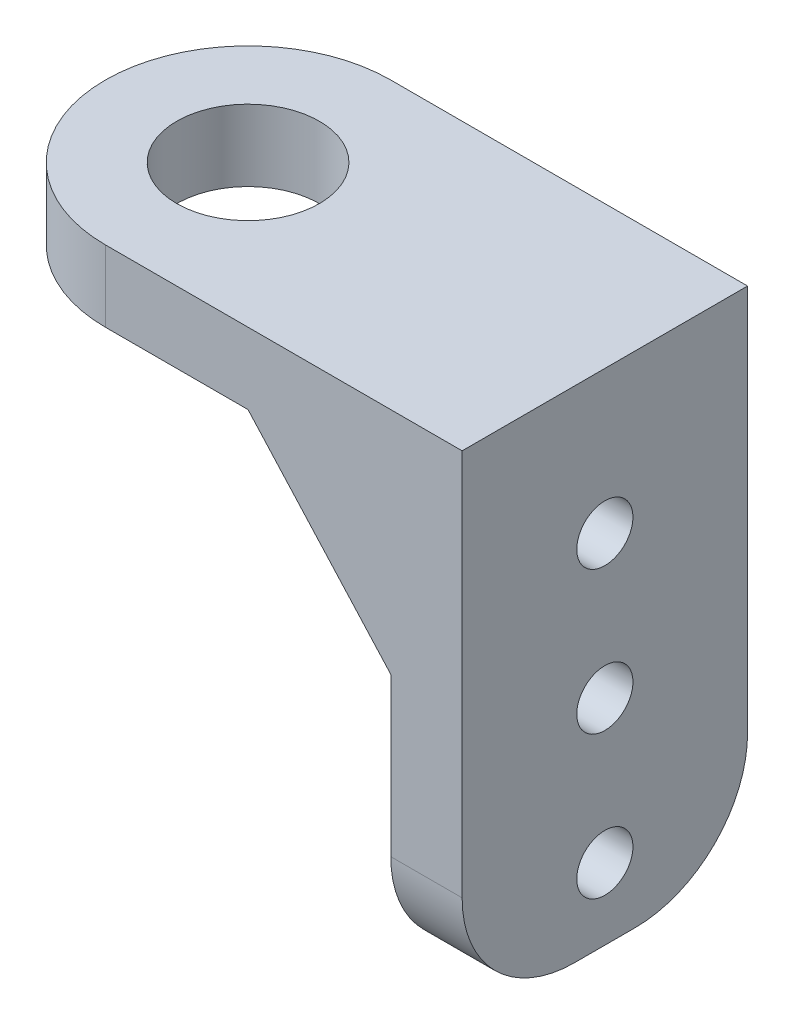
ISO-10303-21;
HEADER;
FILE_DESCRIPTION(('STEP AP214'),'2;1');
FILE_NAME('part.step','',(''),(''),'','','');
FILE_SCHEMA(('AUTOMOTIVE_DESIGN { 1 0 10303 214 1 1 1 1 }'));
ENDSEC;
DATA;
#1=APPLICATION_CONTEXT('core data for automotive mechanical design processes');
#2=APPLICATION_PROTOCOL_DEFINITION('international standard','automotive_design',2000,#1);
#3=PRODUCT_CONTEXT('',#1,'mechanical');
#4=PRODUCT('Part','Part','',(#3));
#5=PRODUCT_RELATED_PRODUCT_CATEGORY('part','',(#4));
#6=PRODUCT_DEFINITION_FORMATION('','',#4);
#7=PRODUCT_DEFINITION_CONTEXT('part definition',#1,'design');
#8=PRODUCT_DEFINITION('design','',#6,#7);
#9=PRODUCT_DEFINITION_SHAPE('','',#8);
#10=(LENGTH_UNIT() NAMED_UNIT(*) SI_UNIT(.MILLI.,.METRE.));
#11=(NAMED_UNIT(*) PLANE_ANGLE_UNIT() SI_UNIT($,.RADIAN.));
#12=(NAMED_UNIT(*) SI_UNIT($,.STERADIAN.) SOLID_ANGLE_UNIT());
#13=UNCERTAINTY_MEASURE_WITH_UNIT(LENGTH_MEASURE(1.E-05),#10,'distance_accuracy_value','');
#14=(GEOMETRIC_REPRESENTATION_CONTEXT(3) GLOBAL_UNCERTAINTY_ASSIGNED_CONTEXT((#13)) GLOBAL_UNIT_ASSIGNED_CONTEXT((#10,
#11,#12)) REPRESENTATION_CONTEXT('',''));
#15=CARTESIAN_POINT('',(0.,0.,0.));
#16=DIRECTION('',(0.,0.,1.));
#17=DIRECTION('',(1.,0.,0.));
#18=AXIS2_PLACEMENT_3D('',#15,#16,#17);
#19=CARTESIAN_POINT('',(0.,3.175,-12.7));
#20=DIRECTION('',(0.,0.,-1.));
#21=DIRECTION('',(-1.,0.,0.));
#22=AXIS2_PLACEMENT_3D('',#19,#20,#21);
#23=PLANE('',#22);
#24=DIRECTION('',(0.670567611253811,-0.741848420324097,0.));
#25=VECTOR('',#24,1.);
#26=CARTESIAN_POINT('',(12.7,-3.175,-12.7));
#27=LINE('',#26,#25);
#28=CARTESIAN_POINT('',(12.7,-3.175,-12.7));
#29=VERTEX_POINT('',#28);
#30=CARTESIAN_POINT('',(25.4,-17.225,-12.7));
#31=VERTEX_POINT('',#30);
#32=EDGE_CURVE('E133',#29,#31,#27,.T.);
#33=ORIENTED_EDGE('',*,*,#32,.F.);
#34=DIRECTION('',(1.,0.,0.));
#35=VECTOR('',#34,1.);
#36=CARTESIAN_POINT('',(0.,-3.175,-12.7));
#37=LINE('',#36,#35);
#38=CARTESIAN_POINT('',(0.,-3.175,-12.7));
#39=VERTEX_POINT('',#38);
#40=EDGE_CURVE('E146',#39,#29,#37,.T.);
#41=ORIENTED_EDGE('',*,*,#40,.F.);
#42=DIRECTION('',(0.,-1.,0.));
#43=VECTOR('',#42,1.);
#44=CARTESIAN_POINT('',(0.,3.175,-12.7));
#45=LINE('',#44,#43);
#46=CARTESIAN_POINT('',(0.,3.175,-12.7));
#47=VERTEX_POINT('',#46);
#48=EDGE_CURVE('E245',#47,#39,#45,.T.);
#49=ORIENTED_EDGE('',*,*,#48,.F.);
#50=DIRECTION('',(1.,0.,0.));
#51=VECTOR('',#50,1.);
#52=CARTESIAN_POINT('',(0.,3.175,-12.7));
#53=LINE('',#52,#51);
#54=CARTESIAN_POINT('',(31.75,3.175,-12.7));
#55=VERTEX_POINT('',#54);
#56=EDGE_CURVE('E205',#47,#55,#53,.T.);
#57=ORIENTED_EDGE('',*,*,#56,.T.);
#58=DIRECTION('',(0.,-1.,0.));
#59=VECTOR('',#58,1.);
#60=CARTESIAN_POINT('',(31.75,3.175,-12.7));
#61=LINE('',#60,#59);
#62=CARTESIAN_POINT('',(31.75,-31.275,-12.7));
#63=VERTEX_POINT('',#62);
#64=EDGE_CURVE('E223',#55,#63,#61,.T.);
#65=ORIENTED_EDGE('',*,*,#64,.T.);
#66=DIRECTION('',(1.,0.,0.));
#67=VECTOR('',#66,1.);
#68=CARTESIAN_POINT('',(0.,-31.2749999999999,-12.7));
#69=LINE('',#68,#67);
#70=CARTESIAN_POINT('',(25.4,-31.275,-12.7));
#71=VERTEX_POINT('',#70);
#72=EDGE_CURVE('E273',#63,#71,#69,.F.);
#73=ORIENTED_EDGE('',*,*,#72,.T.);
#74=DIRECTION('',(0.,-1.,0.));
#75=VECTOR('',#74,1.);
#76=CARTESIAN_POINT('',(25.4,-3.175,-12.7));
#77=LINE('',#76,#75);
#78=EDGE_CURVE('E192',#31,#71,#77,.T.);
#79=ORIENTED_EDGE('',*,*,#78,.F.);
#80=EDGE_LOOP('',(#33,#41,#49,#57,#65,#73,#79));
#81=FACE_BOUND('',#80,.T.);
#82=ADVANCED_FACE('F39',(#81),#23,.T.);
#83=CARTESIAN_POINT('',(0.,3.175,0.));
#84=DIRECTION('',(0.,-1.,0.));
#85=DIRECTION('',(0.,0.,-1.));
#86=AXIS2_PLACEMENT_3D('',#83,#84,#85);
#87=CYLINDRICAL_SURFACE('',#86,12.7);
#88=CARTESIAN_POINT('',(0.,-3.175,0.));
#89=DIRECTION('',(0.,1.,0.));
#90=DIRECTION('',(0.,0.,1.));
#91=AXIS2_PLACEMENT_3D('',#88,#89,#90);
#92=CIRCLE('',#91,12.7);
#93=CARTESIAN_POINT('',(0.,-3.175,12.7));
#94=VERTEX_POINT('',#93);
#95=EDGE_CURVE('E226',#39,#94,#92,.T.);
#96=ORIENTED_EDGE('',*,*,#95,.T.);
#97=DIRECTION('',(0.,-1.,0.));
#98=VECTOR('',#97,1.);
#99=CARTESIAN_POINT('',(0.,3.175,12.7));
#100=LINE('',#99,#98);
#101=CARTESIAN_POINT('',(0.,3.175,12.7));
#102=VERTEX_POINT('',#101);
#103=EDGE_CURVE('E241',#102,#94,#100,.T.);
#104=ORIENTED_EDGE('',*,*,#103,.F.);
#105=CARTESIAN_POINT('',(0.,3.175,0.));
#106=DIRECTION('',(0.,1.,0.));
#107=DIRECTION('',(0.,0.,1.));
#108=AXIS2_PLACEMENT_3D('',#105,#106,#107);
#109=CIRCLE('',#108,12.7);
#110=EDGE_CURVE('E208',#47,#102,#109,.T.);
#111=ORIENTED_EDGE('',*,*,#110,.F.);
#112=ORIENTED_EDGE('',*,*,#48,.T.);
#113=EDGE_LOOP('',(#96,#104,#111,#112));
#114=FACE_BOUND('',#113,.T.);
#115=ADVANCED_FACE('F303',(#114),#87,.T.);
#116=CARTESIAN_POINT('',(0.,3.175,12.7));
#117=DIRECTION('',(0.,0.,1.));
#118=DIRECTION('',(1.,0.,0.));
#119=AXIS2_PLACEMENT_3D('',#116,#117,#118);
#120=PLANE('',#119);
#121=DIRECTION('',(1.,0.,0.));
#122=VECTOR('',#121,1.);
#123=CARTESIAN_POINT('',(0.,-31.2749999999999,12.7));
#124=LINE('',#123,#122);
#125=CARTESIAN_POINT('',(25.4,-31.275,12.7));
#126=VERTEX_POINT('',#125);
#127=CARTESIAN_POINT('',(31.75,-31.275,12.7));
#128=VERTEX_POINT('',#127);
#129=EDGE_CURVE('E248',#126,#128,#124,.T.);
#130=ORIENTED_EDGE('',*,*,#129,.T.);
#131=DIRECTION('',(0.,-1.,0.));
#132=VECTOR('',#131,1.);
#133=CARTESIAN_POINT('',(31.75,3.175,12.7));
#134=LINE('',#133,#132);
#135=CARTESIAN_POINT('',(31.75,3.175,12.7));
#136=VERTEX_POINT('',#135);
#137=EDGE_CURVE('E238',#136,#128,#134,.T.);
#138=ORIENTED_EDGE('',*,*,#137,.F.);
#139=DIRECTION('',(-1.,0.,0.));
#140=VECTOR('',#139,1.);
#141=CARTESIAN_POINT('',(0.,3.175,12.7));
#142=LINE('',#141,#140);
#143=EDGE_CURVE('E213',#136,#102,#142,.T.);
#144=ORIENTED_EDGE('',*,*,#143,.T.);
#145=ORIENTED_EDGE('',*,*,#103,.T.);
#146=DIRECTION('',(-1.,0.,0.));
#147=VECTOR('',#146,1.);
#148=CARTESIAN_POINT('',(0.,-3.175,12.7));
#149=LINE('',#148,#147);
#150=CARTESIAN_POINT('',(12.7,-3.175,12.7));
#151=VERTEX_POINT('',#150);
#152=EDGE_CURVE('E230',#151,#94,#149,.T.);
#153=ORIENTED_EDGE('',*,*,#152,.F.);
#154=DIRECTION('',(0.670567611253811,-0.741848420324097,0.));
#155=VECTOR('',#154,1.);
#156=CARTESIAN_POINT('',(12.7,-3.175,12.7));
#157=LINE('',#156,#155);
#158=CARTESIAN_POINT('',(25.4,-17.225,12.7));
#159=VERTEX_POINT('',#158);
#160=EDGE_CURVE('E152',#151,#159,#157,.T.);
#161=ORIENTED_EDGE('',*,*,#160,.T.);
#162=DIRECTION('',(0.,-1.,0.));
#163=VECTOR('',#162,1.);
#164=CARTESIAN_POINT('',(25.4,-3.175,12.7));
#165=LINE('',#164,#163);
#166=EDGE_CURVE('E170',#159,#126,#165,.T.);
#167=ORIENTED_EDGE('',*,*,#166,.T.);
#168=EDGE_LOOP('',(#130,#138,#144,#145,#153,#161,#167));
#169=FACE_BOUND('',#168,.T.);
#170=ADVANCED_FACE('F297',(#169),#120,.T.);
#171=CARTESIAN_POINT('',(31.75,3.175,0.));
#172=DIRECTION('',(1.,0.,0.));
#173=DIRECTION('',(0.,0.,-1.));
#174=AXIS2_PLACEMENT_3D('',#171,#172,#173);
#175=PLANE('',#174);
#176=CARTESIAN_POINT('',(31.75,-31.275,-2.7));
#177=DIRECTION('',(1.,0.,0.));
#178=DIRECTION('',(0.,0.,-1.));
#179=AXIS2_PLACEMENT_3D('',#176,#177,#178);
#180=CIRCLE('',#179,10.);
#181=CARTESIAN_POINT('',(31.75,-41.275,-2.7));
#182=VERTEX_POINT('',#181);
#183=EDGE_CURVE('E252',#182,#63,#180,.T.);
#184=ORIENTED_EDGE('',*,*,#183,.T.);
#185=ORIENTED_EDGE('',*,*,#64,.F.);
#186=DIRECTION('',(0.,0.,1.));
#187=VECTOR('',#186,1.);
#188=CARTESIAN_POINT('',(31.75,3.175,0.));
#189=LINE('',#188,#187);
#190=EDGE_CURVE('E216',#55,#136,#189,.T.);
#191=ORIENTED_EDGE('',*,*,#190,.T.);
#192=ORIENTED_EDGE('',*,*,#137,.T.);
#193=CARTESIAN_POINT('',(31.75,-31.275,2.7));
#194=DIRECTION('',(1.,0.,0.));
#195=DIRECTION('',(0.,0.,-1.));
#196=AXIS2_PLACEMENT_3D('',#193,#194,#195);
#197=CIRCLE('',#196,10.);
#198=CARTESIAN_POINT('',(31.75,-41.275,2.7));
#199=VERTEX_POINT('',#198);
#200=EDGE_CURVE('E256',#128,#199,#197,.T.);
#201=ORIENTED_EDGE('',*,*,#200,.T.);
#202=DIRECTION('',(0.,0.,1.));
#203=VECTOR('',#202,1.);
#204=CARTESIAN_POINT('',(31.75,-41.275,-51.3255420673937));
#205=LINE('',#204,#203);
#206=EDGE_CURVE('E196',#182,#199,#205,.T.);
#207=ORIENTED_EDGE('',*,*,#206,.F.);
#208=EDGE_LOOP('',(#184,#185,#191,#192,#201,#207));
#209=FACE_BOUND('',#208,.T.);
#210=CARTESIAN_POINT('',(31.75,-34.925,0.));
#211=DIRECTION('',(-1.,0.,0.));
#212=DIRECTION('',(0.,-1.,0.));
#213=AXIS2_PLACEMENT_3D('',#210,#211,#212);
#214=CIRCLE('',#213,2.5);
#215=CARTESIAN_POINT('',(31.75,-37.425,0.));
#216=VERTEX_POINT('',#215);
#217=EDGE_CURVE('E166',#216,#216,#214,.T.);
#218=ORIENTED_EDGE('',*,*,#217,.T.);
#219=EDGE_LOOP('',(#218));
#220=FACE_BOUND('',#219,.T.);
#221=CARTESIAN_POINT('',(31.75,-9.52499999999998,0.));
#222=DIRECTION('',(-1.,0.,0.));
#223=DIRECTION('',(0.,-1.,0.));
#224=AXIS2_PLACEMENT_3D('',#221,#222,#223);
#225=CIRCLE('',#224,2.5);
#226=CARTESIAN_POINT('',(31.75,-12.025,0.));
#227=VERTEX_POINT('',#226);
#228=EDGE_CURVE('E175',#227,#227,#225,.T.);
#229=ORIENTED_EDGE('',*,*,#228,.T.);
#230=EDGE_LOOP('',(#229));
#231=FACE_BOUND('',#230,.T.);
#232=CARTESIAN_POINT('',(31.75,-22.225,0.));
#233=DIRECTION('',(-1.,0.,0.));
#234=DIRECTION('',(0.,-1.,0.));
#235=AXIS2_PLACEMENT_3D('',#232,#233,#234);
#236=CIRCLE('',#235,2.5);
#237=CARTESIAN_POINT('',(31.75,-24.725,0.));
#238=VERTEX_POINT('',#237);
#239=EDGE_CURVE('E183',#238,#238,#236,.T.);
#240=ORIENTED_EDGE('',*,*,#239,.T.);
#241=EDGE_LOOP('',(#240));
#242=FACE_BOUND('',#241,.T.);
#243=ADVANCED_FACE('F319',(#209,#220,#231,#242),#175,.T.);
#244=CARTESIAN_POINT('',(0.,3.175,0.));
#245=DIRECTION('',(0.,-1.,0.));
#246=DIRECTION('',(0.,0.,-1.));
#247=AXIS2_PLACEMENT_3D('',#244,#245,#246);
#248=CYLINDRICAL_SURFACE('',#247,6.35);
#249=CARTESIAN_POINT('',(0.,3.175,0.));
#250=DIRECTION('',(0.,1.,0.));
#251=DIRECTION('',(0.,0.,1.));
#252=AXIS2_PLACEMENT_3D('',#249,#250,#251);
#253=CIRCLE('',#252,6.35);
#254=CARTESIAN_POINT('',(0.,3.175,6.35));
#255=VERTEX_POINT('',#254);
#256=EDGE_CURVE('E219',#255,#255,#253,.T.);
#257=ORIENTED_EDGE('',*,*,#256,.T.);
#258=EDGE_LOOP('',(#257));
#259=FACE_BOUND('',#258,.T.);
#260=CARTESIAN_POINT('',(0.,-3.175,0.));
#261=DIRECTION('',(0.,1.,0.));
#262=DIRECTION('',(0.,0.,1.));
#263=AXIS2_PLACEMENT_3D('',#260,#261,#262);
#264=CIRCLE('',#263,6.35);
#265=CARTESIAN_POINT('',(0.,-3.175,6.35));
#266=VERTEX_POINT('',#265);
#267=EDGE_CURVE('E209',#266,#266,#264,.T.);
#268=ORIENTED_EDGE('',*,*,#267,.F.);
#269=EDGE_LOOP('',(#268));
#270=FACE_BOUND('',#269,.T.);
#271=ADVANCED_FACE('F331',(#259,#270),#248,.F.);
#272=CARTESIAN_POINT('',(0.,3.175,0.));
#273=DIRECTION('',(0.,1.,0.));
#274=DIRECTION('',(0.,0.,1.));
#275=AXIS2_PLACEMENT_3D('',#272,#273,#274);
#276=PLANE('',#275);
#277=ORIENTED_EDGE('',*,*,#190,.F.);
#278=ORIENTED_EDGE('',*,*,#56,.F.);
#279=ORIENTED_EDGE('',*,*,#110,.T.);
#280=ORIENTED_EDGE('',*,*,#143,.F.);
#281=EDGE_LOOP('',(#277,#278,#279,#280));
#282=FACE_BOUND('',#281,.T.);
#283=ORIENTED_EDGE('',*,*,#256,.F.);
#284=EDGE_LOOP('',(#283));
#285=FACE_BOUND('',#284,.T.);
#286=ADVANCED_FACE('F327',(#282,#285),#276,.T.);
#287=CARTESIAN_POINT('',(0.,-3.175,0.));
#288=DIRECTION('',(0.,1.,0.));
#289=DIRECTION('',(0.,0.,1.));
#290=AXIS2_PLACEMENT_3D('',#287,#288,#289);
#291=PLANE('',#290);
#292=ORIENTED_EDGE('',*,*,#40,.T.);
#293=DIRECTION('',(0.,0.,-1.));
#294=VECTOR('',#293,1.);
#295=CARTESIAN_POINT('',(12.7,-3.175,0.));
#296=LINE('',#295,#294);
#297=CARTESIAN_POINT('',(12.7,-3.175,-8.7));
#298=VERTEX_POINT('',#297);
#299=EDGE_CURVE('E132',#29,#298,#296,.F.);
#300=ORIENTED_EDGE('',*,*,#299,.T.);
#301=DIRECTION('',(-1.,0.,0.));
#302=VECTOR('',#301,1.);
#303=CARTESIAN_POINT('',(0.,-3.175,-8.7));
#304=LINE('',#303,#302);
#305=CARTESIAN_POINT('',(25.4,-3.175,-8.7));
#306=VERTEX_POINT('',#305);
#307=EDGE_CURVE('E127',#306,#298,#304,.T.);
#308=ORIENTED_EDGE('',*,*,#307,.F.);
#309=DIRECTION('',(0.,0.,1.));
#310=VECTOR('',#309,1.);
#311=CARTESIAN_POINT('',(25.4,-3.175,-51.3255420673937));
#312=LINE('',#311,#310);
#313=CARTESIAN_POINT('',(25.4,-3.175,8.7));
#314=VERTEX_POINT('',#313);
#315=EDGE_CURVE('E62',#306,#314,#312,.T.);
#316=ORIENTED_EDGE('',*,*,#315,.T.);
#317=DIRECTION('',(1.,0.,0.));
#318=VECTOR('',#317,1.);
#319=CARTESIAN_POINT('',(0.,-3.175,8.7));
#320=LINE('',#319,#318);
#321=CARTESIAN_POINT('',(12.7,-3.175,8.7));
#322=VERTEX_POINT('',#321);
#323=EDGE_CURVE('E157',#322,#314,#320,.T.);
#324=ORIENTED_EDGE('',*,*,#323,.F.);
#325=DIRECTION('',(0.,0.,1.));
#326=VECTOR('',#325,1.);
#327=CARTESIAN_POINT('',(12.7,-3.175,0.));
#328=LINE('',#327,#326);
#329=EDGE_CURVE('E161',#322,#151,#328,.T.);
#330=ORIENTED_EDGE('',*,*,#329,.T.);
#331=ORIENTED_EDGE('',*,*,#152,.T.);
#332=ORIENTED_EDGE('',*,*,#95,.F.);
#333=EDGE_LOOP('',(#292,#300,#308,#316,#324,#330,#331,#332));
#334=FACE_BOUND('',#333,.T.);
#335=ORIENTED_EDGE('',*,*,#267,.T.);
#336=EDGE_LOOP('',(#335));
#337=FACE_BOUND('',#336,.T.);
#338=ADVANCED_FACE('F142',(#334,#337),#291,.F.);
#339=CARTESIAN_POINT('',(25.4,-3.175,-51.3255420673937));
#340=DIRECTION('',(-1.,0.,0.));
#341=DIRECTION('',(0.,-1.,0.));
#342=AXIS2_PLACEMENT_3D('',#339,#340,#341);
#343=PLANE('',#342);
#344=DIRECTION('',(0.,0.,-1.));
#345=VECTOR('',#344,1.);
#346=CARTESIAN_POINT('',(25.4,-17.225,-51.3255420673937));
#347=LINE('',#346,#345);
#348=CARTESIAN_POINT('',(25.4,-17.225,-8.7));
#349=VERTEX_POINT('',#348);
#350=EDGE_CURVE('E11',#31,#349,#347,.F.);
#351=ORIENTED_EDGE('',*,*,#350,.F.);
#352=ORIENTED_EDGE('',*,*,#78,.T.);
#353=CARTESIAN_POINT('',(25.4,-31.275,-2.7));
#354=DIRECTION('',(-1.,0.,0.));
#355=DIRECTION('',(0.,-1.,0.));
#356=AXIS2_PLACEMENT_3D('',#353,#354,#355);
#357=CIRCLE('',#356,10.);
#358=CARTESIAN_POINT('',(25.4,-41.275,-2.7));
#359=VERTEX_POINT('',#358);
#360=EDGE_CURVE('E266',#71,#359,#357,.T.);
#361=ORIENTED_EDGE('',*,*,#360,.T.);
#362=DIRECTION('',(0.,0.,1.));
#363=VECTOR('',#362,1.);
#364=CARTESIAN_POINT('',(25.4,-41.275,-51.3255420673937));
#365=LINE('',#364,#363);
#366=CARTESIAN_POINT('',(25.4,-41.275,2.7));
#367=VERTEX_POINT('',#366);
#368=EDGE_CURVE('E195',#359,#367,#365,.T.);
#369=ORIENTED_EDGE('',*,*,#368,.T.);
#370=CARTESIAN_POINT('',(25.4,-31.275,2.7));
#371=DIRECTION('',(-1.,0.,0.));
#372=DIRECTION('',(0.,-1.,0.));
#373=AXIS2_PLACEMENT_3D('',#370,#371,#372);
#374=CIRCLE('',#373,10.);
#375=EDGE_CURVE('E269',#367,#126,#374,.T.);
#376=ORIENTED_EDGE('',*,*,#375,.T.);
#377=ORIENTED_EDGE('',*,*,#166,.F.);
#378=DIRECTION('',(0.,0.,1.));
#379=VECTOR('',#378,1.);
#380=CARTESIAN_POINT('',(25.4,-17.225,-51.3255420673937));
#381=LINE('',#380,#379);
#382=CARTESIAN_POINT('',(25.4,-17.225,8.7));
#383=VERTEX_POINT('',#382);
#384=EDGE_CURVE('E281',#383,#159,#381,.T.);
#385=ORIENTED_EDGE('',*,*,#384,.F.);
#386=DIRECTION('',(0.,1.,0.));
#387=VECTOR('',#386,1.);
#388=CARTESIAN_POINT('',(25.4,-3.175,8.7));
#389=LINE('',#388,#387);
#390=EDGE_CURVE('E277',#383,#314,#389,.T.);
#391=ORIENTED_EDGE('',*,*,#390,.T.);
#392=ORIENTED_EDGE('',*,*,#315,.F.);
#393=DIRECTION('',(0.,-1.,0.));
#394=VECTOR('',#393,1.);
#395=CARTESIAN_POINT('',(25.4,-3.175,-8.7));
#396=LINE('',#395,#394);
#397=EDGE_CURVE('E48',#306,#349,#396,.T.);
#398=ORIENTED_EDGE('',*,*,#397,.T.);
#399=EDGE_LOOP('',(#351,#352,#361,#369,#376,#377,#385,#391,#392,#398));
#400=FACE_BOUND('',#399,.T.);
#401=CARTESIAN_POINT('',(25.4,-34.925,0.));
#402=DIRECTION('',(-1.,0.,0.));
#403=DIRECTION('',(0.,-1.,0.));
#404=AXIS2_PLACEMENT_3D('',#401,#402,#403);
#405=CIRCLE('',#404,2.5);
#406=CARTESIAN_POINT('',(25.4,-37.425,0.));
#407=VERTEX_POINT('',#406);
#408=EDGE_CURVE('E171',#407,#407,#405,.T.);
#409=ORIENTED_EDGE('',*,*,#408,.F.);
#410=EDGE_LOOP('',(#409));
#411=FACE_BOUND('',#410,.T.);
#412=CARTESIAN_POINT('',(25.4,-9.52499999999998,0.));
#413=DIRECTION('',(-1.,0.,0.));
#414=DIRECTION('',(0.,-1.,0.));
#415=AXIS2_PLACEMENT_3D('',#412,#413,#414);
#416=CIRCLE('',#415,2.5);
#417=CARTESIAN_POINT('',(25.4,-12.025,0.));
#418=VERTEX_POINT('',#417);
#419=EDGE_CURVE('E179',#418,#418,#416,.T.);
#420=ORIENTED_EDGE('',*,*,#419,.F.);
#421=EDGE_LOOP('',(#420));
#422=FACE_BOUND('',#421,.T.);
#423=CARTESIAN_POINT('',(25.4,-22.225,0.));
#424=DIRECTION('',(-1.,0.,0.));
#425=DIRECTION('',(0.,-1.,0.));
#426=AXIS2_PLACEMENT_3D('',#423,#424,#425);
#427=CIRCLE('',#426,2.5);
#428=CARTESIAN_POINT('',(25.4,-24.725,0.));
#429=VERTEX_POINT('',#428);
#430=EDGE_CURVE('E165',#429,#429,#427,.T.);
#431=ORIENTED_EDGE('',*,*,#430,.F.);
#432=EDGE_LOOP('',(#431));
#433=FACE_BOUND('',#432,.T.);
#434=ADVANCED_FACE('F285',(#400,#411,#422,#433),#343,.T.);
#435=CARTESIAN_POINT('',(31.75,-41.275,-51.3255420673937));
#436=DIRECTION('',(0.,-1.,0.));
#437=DIRECTION('',(1.,0.,0.));
#438=AXIS2_PLACEMENT_3D('',#435,#436,#437);
#439=PLANE('',#438);
#440=ORIENTED_EDGE('',*,*,#206,.T.);
#441=DIRECTION('',(1.,0.,0.));
#442=VECTOR('',#441,1.);
#443=CARTESIAN_POINT('',(31.75,-41.275,2.7));
#444=LINE('',#443,#442);
#445=EDGE_CURVE('E263',#199,#367,#444,.F.);
#446=ORIENTED_EDGE('',*,*,#445,.T.);
#447=ORIENTED_EDGE('',*,*,#368,.F.);
#448=DIRECTION('',(1.,0.,0.));
#449=VECTOR('',#448,1.);
#450=CARTESIAN_POINT('',(31.75,-41.275,-2.7));
#451=LINE('',#450,#449);
#452=EDGE_CURVE('E259',#359,#182,#451,.T.);
#453=ORIENTED_EDGE('',*,*,#452,.T.);
#454=EDGE_LOOP('',(#440,#446,#447,#453));
#455=FACE_BOUND('',#454,.T.);
#456=ADVANCED_FACE('F314',(#455),#439,.T.);
#457=CARTESIAN_POINT('',(31.75,-22.225,0.));
#458=DIRECTION('',(-1.,0.,0.));
#459=DIRECTION('',(0.,-1.,0.));
#460=AXIS2_PLACEMENT_3D('',#457,#458,#459);
#461=CYLINDRICAL_SURFACE('',#460,2.5);
#462=ORIENTED_EDGE('',*,*,#239,.F.);
#463=EDGE_LOOP('',(#462));
#464=FACE_BOUND('',#463,.T.);
#465=ORIENTED_EDGE('',*,*,#430,.T.);
#466=EDGE_LOOP('',(#465));
#467=FACE_BOUND('',#466,.T.);
#468=ADVANCED_FACE('F364',(#464,#467),#461,.F.);
#469=CARTESIAN_POINT('',(31.75,-9.52499999999998,0.));
#470=DIRECTION('',(-1.,0.,0.));
#471=DIRECTION('',(0.,-1.,0.));
#472=AXIS2_PLACEMENT_3D('',#469,#470,#471);
#473=CYLINDRICAL_SURFACE('',#472,2.5);
#474=ORIENTED_EDGE('',*,*,#228,.F.);
#475=EDGE_LOOP('',(#474));
#476=FACE_BOUND('',#475,.T.);
#477=ORIENTED_EDGE('',*,*,#419,.T.);
#478=EDGE_LOOP('',(#477));
#479=FACE_BOUND('',#478,.T.);
#480=ADVANCED_FACE('F358',(#476,#479),#473,.F.);
#481=CARTESIAN_POINT('',(31.75,-34.925,0.));
#482=DIRECTION('',(-1.,0.,0.));
#483=DIRECTION('',(0.,-1.,0.));
#484=AXIS2_PLACEMENT_3D('',#481,#482,#483);
#485=CYLINDRICAL_SURFACE('',#484,2.5);
#486=ORIENTED_EDGE('',*,*,#217,.F.);
#487=EDGE_LOOP('',(#486));
#488=FACE_BOUND('',#487,.T.);
#489=ORIENTED_EDGE('',*,*,#408,.T.);
#490=EDGE_LOOP('',(#489));
#491=FACE_BOUND('',#490,.T.);
#492=ADVANCED_FACE('F353',(#488,#491),#485,.F.);
#493=CARTESIAN_POINT('',(0.,-31.2749999999999,2.7));
#494=DIRECTION('',(1.,0.,0.));
#495=DIRECTION('',(0.,1.,0.));
#496=AXIS2_PLACEMENT_3D('',#493,#494,#495);
#497=CYLINDRICAL_SURFACE('',#496,10.);
#498=ORIENTED_EDGE('',*,*,#375,.F.);
#499=ORIENTED_EDGE('',*,*,#445,.F.);
#500=ORIENTED_EDGE('',*,*,#200,.F.);
#501=ORIENTED_EDGE('',*,*,#129,.F.);
#502=EDGE_LOOP('',(#498,#499,#500,#501));
#503=FACE_BOUND('',#502,.T.);
#504=ADVANCED_FACE('F324',(#503),#497,.T.);
#505=CARTESIAN_POINT('',(31.75,-31.275,-2.7));
#506=DIRECTION('',(1.,0.,0.));
#507=DIRECTION('',(0.,1.,0.));
#508=AXIS2_PLACEMENT_3D('',#505,#506,#507);
#509=CYLINDRICAL_SURFACE('',#508,10.);
#510=ORIENTED_EDGE('',*,*,#360,.F.);
#511=ORIENTED_EDGE('',*,*,#72,.F.);
#512=ORIENTED_EDGE('',*,*,#183,.F.);
#513=ORIENTED_EDGE('',*,*,#452,.F.);
#514=EDGE_LOOP('',(#510,#511,#512,#513));
#515=FACE_BOUND('',#514,.T.);
#516=ADVANCED_FACE('F41',(#515),#509,.T.);
#517=CARTESIAN_POINT('',(12.7,-3.175,8.7));
#518=DIRECTION('',(-0.741848420324097,-0.670567611253811,0.));
#519=DIRECTION('',(0.670567611253811,-0.741848420324097,0.));
#520=AXIS2_PLACEMENT_3D('',#517,#518,#519);
#521=PLANE('',#520);
#522=ORIENTED_EDGE('',*,*,#329,.F.);
#523=DIRECTION('',(0.670567611253811,-0.741848420324097,0.));
#524=VECTOR('',#523,1.);
#525=CARTESIAN_POINT('',(12.7,-3.175,8.7));
#526=LINE('',#525,#524);
#527=EDGE_CURVE('E148',#322,#383,#526,.T.);
#528=ORIENTED_EDGE('',*,*,#527,.T.);
#529=ORIENTED_EDGE('',*,*,#384,.T.);
#530=ORIENTED_EDGE('',*,*,#160,.F.);
#531=EDGE_LOOP('',(#522,#528,#529,#530));
#532=FACE_BOUND('',#531,.T.);
#533=ADVANCED_FACE('F294',(#532),#521,.T.);
#534=CARTESIAN_POINT('',(9.52500000000001,-19.05,8.7));
#535=DIRECTION('',(0.,0.,1.));
#536=DIRECTION('',(1.,0.,0.));
#537=AXIS2_PLACEMENT_3D('',#534,#535,#536);
#538=PLANE('',#537);
#539=ORIENTED_EDGE('',*,*,#527,.F.);
#540=ORIENTED_EDGE('',*,*,#323,.T.);
#541=ORIENTED_EDGE('',*,*,#390,.F.);
#542=EDGE_LOOP('',(#539,#540,#541));
#543=FACE_BOUND('',#542,.T.);
#544=ADVANCED_FACE('F292',(#543),#538,.F.);
#545=CARTESIAN_POINT('',(12.7,-3.175,-8.7));
#546=DIRECTION('',(0.741848420324097,0.670567611253811,0.));
#547=DIRECTION('',(0.670567611253811,-0.741848420324097,0.));
#548=AXIS2_PLACEMENT_3D('',#545,#546,#547);
#549=PLANE('',#548);
#550=ORIENTED_EDGE('',*,*,#299,.F.);
#551=ORIENTED_EDGE('',*,*,#32,.T.);
#552=ORIENTED_EDGE('',*,*,#350,.T.);
#553=DIRECTION('',(0.670567611253811,-0.741848420324097,0.));
#554=VECTOR('',#553,1.);
#555=CARTESIAN_POINT('',(12.7,-3.175,-8.7));
#556=LINE('',#555,#554);
#557=EDGE_CURVE('E55',#298,#349,#556,.T.);
#558=ORIENTED_EDGE('',*,*,#557,.F.);
#559=EDGE_LOOP('',(#550,#551,#552,#558));
#560=FACE_BOUND('',#559,.T.);
#561=ADVANCED_FACE('F136',(#560),#549,.F.);
#562=CARTESIAN_POINT('',(9.52500000000001,-19.05,-8.7));
#563=DIRECTION('',(0.,0.,-1.));
#564=DIRECTION('',(-1.,0.,0.));
#565=AXIS2_PLACEMENT_3D('',#562,#563,#564);
#566=PLANE('',#565);
#567=ORIENTED_EDGE('',*,*,#397,.F.);
#568=ORIENTED_EDGE('',*,*,#307,.T.);
#569=ORIENTED_EDGE('',*,*,#557,.T.);
#570=EDGE_LOOP('',(#567,#568,#569));
#571=FACE_BOUND('',#570,.T.);
#572=ADVANCED_FACE('F128',(#571),#566,.F.);
#573=CLOSED_SHELL('',(#82,#115,#170,#243,#271,#286,#338,#434,#456,#468,#480,#492,#504,#516,#533,
#544,#561,#572));
#574=MANIFOLD_SOLID_BREP('B2',#573);
#575=ADVANCED_BREP_SHAPE_REPRESENTATION('',(#18,#574),#14);
#576=SHAPE_DEFINITION_REPRESENTATION(#9,#575);
ENDSEC;
END-ISO-10303-21;
